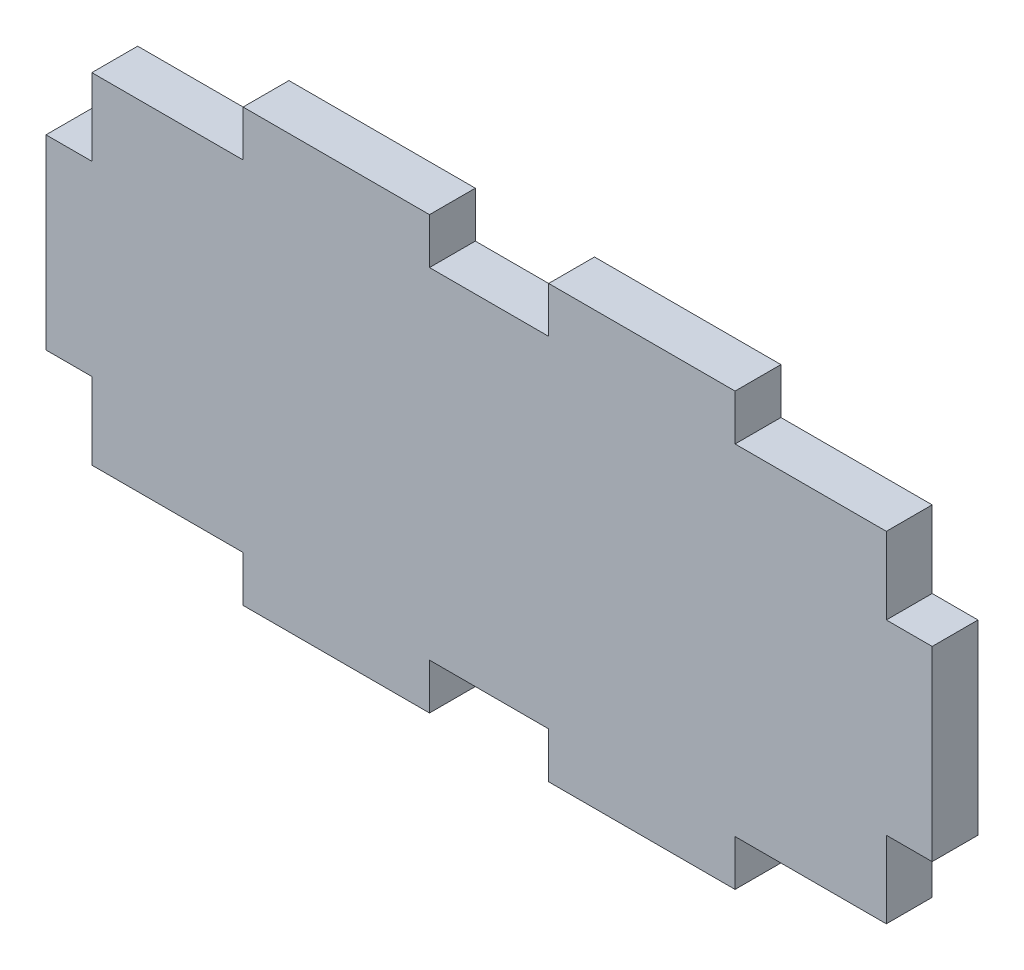
ISO-10303-21;
HEADER;
FILE_DESCRIPTION(('STEP AP214'),'2;1');
FILE_NAME('part.step','',(''),(''),'','','');
FILE_SCHEMA(('AUTOMOTIVE_DESIGN { 1 0 10303 214 1 1 1 1 }'));
ENDSEC;
DATA;
#1=APPLICATION_CONTEXT('core data for automotive mechanical design processes');
#2=APPLICATION_PROTOCOL_DEFINITION('international standard','automotive_design',2000,#1);
#3=PRODUCT_CONTEXT('',#1,'mechanical');
#4=PRODUCT('Part','Part','',(#3));
#5=PRODUCT_RELATED_PRODUCT_CATEGORY('part','',(#4));
#6=PRODUCT_DEFINITION_FORMATION('','',#4);
#7=PRODUCT_DEFINITION_CONTEXT('part definition',#1,'design');
#8=PRODUCT_DEFINITION('design','',#6,#7);
#9=PRODUCT_DEFINITION_SHAPE('','',#8);
#10=(LENGTH_UNIT() NAMED_UNIT(*) SI_UNIT(.MILLI.,.METRE.));
#11=(NAMED_UNIT(*) PLANE_ANGLE_UNIT() SI_UNIT($,.RADIAN.));
#12=(NAMED_UNIT(*) SI_UNIT($,.STERADIAN.) SOLID_ANGLE_UNIT());
#13=UNCERTAINTY_MEASURE_WITH_UNIT(LENGTH_MEASURE(1.E-05),#10,'distance_accuracy_value','');
#14=(GEOMETRIC_REPRESENTATION_CONTEXT(3) GLOBAL_UNCERTAINTY_ASSIGNED_CONTEXT((#13)) GLOBAL_UNIT_ASSIGNED_CONTEXT((#10,
#11,#12)) REPRESENTATION_CONTEXT('',''));
#15=CARTESIAN_POINT('',(0.,0.,0.));
#16=DIRECTION('',(0.,0.,1.));
#17=DIRECTION('',(1.,0.,0.));
#18=AXIS2_PLACEMENT_3D('',#15,#16,#17);
#19=CARTESIAN_POINT('',(12.9,25.25,3.));
#20=DIRECTION('',(1.,0.,0.));
#21=DIRECTION('',(0.,0.,-1.));
#22=AXIS2_PLACEMENT_3D('',#19,#20,#21);
#23=PLANE('',#22);
#24=DIRECTION('',(0.,-1.,0.));
#25=VECTOR('',#24,1.);
#26=CARTESIAN_POINT('',(12.9,25.25,0.));
#27=LINE('',#26,#25);
#28=CARTESIAN_POINT('',(12.9,28.25,0.));
#29=VERTEX_POINT('',#28);
#30=CARTESIAN_POINT('',(12.9,25.25,0.));
#31=VERTEX_POINT('',#30);
#32=EDGE_CURVE('E248',#29,#31,#27,.T.);
#33=ORIENTED_EDGE('',*,*,#32,.T.);
#34=DIRECTION('',(0.,0.,-1.));
#35=VECTOR('',#34,1.);
#36=CARTESIAN_POINT('',(12.9,25.25,3.));
#37=LINE('',#36,#35);
#38=CARTESIAN_POINT('',(12.9,25.25,3.));
#39=VERTEX_POINT('',#38);
#40=EDGE_CURVE('E11',#39,#31,#37,.T.);
#41=ORIENTED_EDGE('',*,*,#40,.F.);
#42=DIRECTION('',(0.,-1.,0.));
#43=VECTOR('',#42,1.);
#44=CARTESIAN_POINT('',(12.9,25.25,3.));
#45=LINE('',#44,#43);
#46=CARTESIAN_POINT('',(12.9,28.25,3.));
#47=VERTEX_POINT('',#46);
#48=EDGE_CURVE('E302',#47,#39,#45,.T.);
#49=ORIENTED_EDGE('',*,*,#48,.F.);
#50=DIRECTION('',(0.,0.,-1.));
#51=VECTOR('',#50,1.);
#52=CARTESIAN_POINT('',(12.9,28.25,3.));
#53=LINE('',#52,#51);
#54=EDGE_CURVE('E244',#47,#29,#53,.T.);
#55=ORIENTED_EDGE('',*,*,#54,.T.);
#56=EDGE_LOOP('',(#33,#41,#49,#55));
#57=FACE_BOUND('',#56,.T.);
#58=ADVANCED_FACE('F32',(#57),#23,.F.);
#59=CARTESIAN_POINT('',(3.,25.25,3.));
#60=DIRECTION('',(0.,-1.,0.));
#61=DIRECTION('',(0.,0.,-1.));
#62=AXIS2_PLACEMENT_3D('',#59,#60,#61);
#63=PLANE('',#62);
#64=DIRECTION('',(-1.,0.,0.));
#65=VECTOR('',#64,1.);
#66=CARTESIAN_POINT('',(3.,25.25,0.));
#67=LINE('',#66,#65);
#68=CARTESIAN_POINT('',(3.,25.25,0.));
#69=VERTEX_POINT('',#68);
#70=EDGE_CURVE('E251',#31,#69,#67,.T.);
#71=ORIENTED_EDGE('',*,*,#70,.T.);
#72=DIRECTION('',(0.,0.,-1.));
#73=VECTOR('',#72,1.);
#74=CARTESIAN_POINT('',(3.,25.25,3.));
#75=LINE('',#74,#73);
#76=CARTESIAN_POINT('',(3.,25.25,3.));
#77=VERTEX_POINT('',#76);
#78=EDGE_CURVE('E40',#77,#69,#75,.T.);
#79=ORIENTED_EDGE('',*,*,#78,.F.);
#80=DIRECTION('',(-1.,0.,0.));
#81=VECTOR('',#80,1.);
#82=CARTESIAN_POINT('',(3.,25.25,3.));
#83=LINE('',#82,#81);
#84=EDGE_CURVE('E151',#39,#77,#83,.T.);
#85=ORIENTED_EDGE('',*,*,#84,.F.);
#86=ORIENTED_EDGE('',*,*,#40,.T.);
#87=EDGE_LOOP('',(#71,#79,#85,#86));
#88=FACE_BOUND('',#87,.T.);
#89=ADVANCED_FACE('F460',(#88),#63,.F.);
#90=CARTESIAN_POINT('',(3.,20.225,3.));
#91=DIRECTION('',(1.,0.,0.));
#92=DIRECTION('',(0.,0.,-1.));
#93=AXIS2_PLACEMENT_3D('',#90,#91,#92);
#94=PLANE('',#93);
#95=DIRECTION('',(0.,-1.,0.));
#96=VECTOR('',#95,1.);
#97=CARTESIAN_POINT('',(3.,20.225,0.));
#98=LINE('',#97,#96);
#99=CARTESIAN_POINT('',(3.,20.225,0.));
#100=VERTEX_POINT('',#99);
#101=EDGE_CURVE('E253',#69,#100,#98,.T.);
#102=ORIENTED_EDGE('',*,*,#101,.T.);
#103=DIRECTION('',(0.,0.,-1.));
#104=VECTOR('',#103,1.);
#105=CARTESIAN_POINT('',(3.,20.225,3.));
#106=LINE('',#105,#104);
#107=CARTESIAN_POINT('',(3.,20.225,3.));
#108=VERTEX_POINT('',#107);
#109=EDGE_CURVE('E369',#108,#100,#106,.T.);
#110=ORIENTED_EDGE('',*,*,#109,.F.);
#111=DIRECTION('',(0.,-1.,0.));
#112=VECTOR('',#111,1.);
#113=CARTESIAN_POINT('',(3.,20.225,3.));
#114=LINE('',#113,#112);
#115=EDGE_CURVE('E377',#77,#108,#114,.T.);
#116=ORIENTED_EDGE('',*,*,#115,.F.);
#117=ORIENTED_EDGE('',*,*,#78,.T.);
#118=EDGE_LOOP('',(#102,#110,#116,#117));
#119=FACE_BOUND('',#118,.T.);
#120=ADVANCED_FACE('F375',(#119),#94,.F.);
#121=CARTESIAN_POINT('',(0.,20.225,3.));
#122=DIRECTION('',(0.,-1.,0.));
#123=DIRECTION('',(0.,0.,-1.));
#124=AXIS2_PLACEMENT_3D('',#121,#122,#123);
#125=PLANE('',#124);
#126=DIRECTION('',(-1.,0.,0.));
#127=VECTOR('',#126,1.);
#128=CARTESIAN_POINT('',(0.,20.225,0.));
#129=LINE('',#128,#127);
#130=CARTESIAN_POINT('',(0.,20.225,0.));
#131=VERTEX_POINT('',#130);
#132=EDGE_CURVE('E255',#100,#131,#129,.T.);
#133=ORIENTED_EDGE('',*,*,#132,.T.);
#134=DIRECTION('',(0.,0.,-1.));
#135=VECTOR('',#134,1.);
#136=CARTESIAN_POINT('',(0.,20.225,3.));
#137=LINE('',#136,#135);
#138=CARTESIAN_POINT('',(0.,20.225,3.));
#139=VERTEX_POINT('',#138);
#140=EDGE_CURVE('E366',#139,#131,#137,.T.);
#141=ORIENTED_EDGE('',*,*,#140,.F.);
#142=DIRECTION('',(-1.,0.,0.));
#143=VECTOR('',#142,1.);
#144=CARTESIAN_POINT('',(0.,20.225,3.));
#145=LINE('',#144,#143);
#146=EDGE_CURVE('E395',#108,#139,#145,.T.);
#147=ORIENTED_EDGE('',*,*,#146,.F.);
#148=ORIENTED_EDGE('',*,*,#109,.T.);
#149=EDGE_LOOP('',(#133,#141,#147,#148));
#150=FACE_BOUND('',#149,.T.);
#151=ADVANCED_FACE('F386',(#150),#125,.F.);
#152=CARTESIAN_POINT('',(0.,8.025,3.));
#153=DIRECTION('',(1.,0.,0.));
#154=DIRECTION('',(0.,1.,0.));
#155=AXIS2_PLACEMENT_3D('',#152,#153,#154);
#156=PLANE('',#155);
#157=DIRECTION('',(0.,-1.,0.));
#158=VECTOR('',#157,1.);
#159=CARTESIAN_POINT('',(0.,8.025,0.));
#160=LINE('',#159,#158);
#161=CARTESIAN_POINT('',(0.,8.025,0.));
#162=VERTEX_POINT('',#161);
#163=EDGE_CURVE('E257',#131,#162,#160,.T.);
#164=ORIENTED_EDGE('',*,*,#163,.T.);
#165=DIRECTION('',(0.,0.,-1.));
#166=VECTOR('',#165,1.);
#167=CARTESIAN_POINT('',(0.,8.025,3.));
#168=LINE('',#167,#166);
#169=CARTESIAN_POINT('',(0.,8.025,3.));
#170=VERTEX_POINT('',#169);
#171=EDGE_CURVE('E363',#170,#162,#168,.T.);
#172=ORIENTED_EDGE('',*,*,#171,.F.);
#173=DIRECTION('',(0.,-1.,0.));
#174=VECTOR('',#173,1.);
#175=CARTESIAN_POINT('',(0.,8.025,3.));
#176=LINE('',#175,#174);
#177=EDGE_CURVE('E392',#139,#170,#176,.T.);
#178=ORIENTED_EDGE('',*,*,#177,.F.);
#179=ORIENTED_EDGE('',*,*,#140,.T.);
#180=EDGE_LOOP('',(#164,#172,#178,#179));
#181=FACE_BOUND('',#180,.T.);
#182=ADVANCED_FACE('F390',(#181),#156,.F.);
#183=CARTESIAN_POINT('',(0.,8.025,3.));
#184=DIRECTION('',(0.,1.,0.));
#185=DIRECTION('',(0.,0.,1.));
#186=AXIS2_PLACEMENT_3D('',#183,#184,#185);
#187=PLANE('',#186);
#188=DIRECTION('',(1.,0.,0.));
#189=VECTOR('',#188,1.);
#190=CARTESIAN_POINT('',(0.,8.025,0.));
#191=LINE('',#190,#189);
#192=CARTESIAN_POINT('',(3.,8.025,0.));
#193=VERTEX_POINT('',#192);
#194=EDGE_CURVE('E259',#162,#193,#191,.T.);
#195=ORIENTED_EDGE('',*,*,#194,.T.);
#196=DIRECTION('',(0.,0.,-1.));
#197=VECTOR('',#196,1.);
#198=CARTESIAN_POINT('',(3.,8.025,3.));
#199=LINE('',#198,#197);
#200=CARTESIAN_POINT('',(3.,8.025,3.));
#201=VERTEX_POINT('',#200);
#202=EDGE_CURVE('E360',#201,#193,#199,.T.);
#203=ORIENTED_EDGE('',*,*,#202,.F.);
#204=DIRECTION('',(1.,0.,0.));
#205=VECTOR('',#204,1.);
#206=CARTESIAN_POINT('',(0.,8.025,3.));
#207=LINE('',#206,#205);
#208=EDGE_CURVE('E394',#170,#201,#207,.T.);
#209=ORIENTED_EDGE('',*,*,#208,.F.);
#210=ORIENTED_EDGE('',*,*,#171,.T.);
#211=EDGE_LOOP('',(#195,#203,#209,#210));
#212=FACE_BOUND('',#211,.T.);
#213=ADVANCED_FACE('F473',(#212),#187,.F.);
#214=CARTESIAN_POINT('',(3.,8.025,3.));
#215=DIRECTION('',(1.,0.,0.));
#216=DIRECTION('',(0.,0.,-1.));
#217=AXIS2_PLACEMENT_3D('',#214,#215,#216);
#218=PLANE('',#217);
#219=DIRECTION('',(0.,-1.,0.));
#220=VECTOR('',#219,1.);
#221=CARTESIAN_POINT('',(3.,8.025,0.));
#222=LINE('',#221,#220);
#223=CARTESIAN_POINT('',(3.,3.,0.));
#224=VERTEX_POINT('',#223);
#225=EDGE_CURVE('E261',#193,#224,#222,.T.);
#226=ORIENTED_EDGE('',*,*,#225,.T.);
#227=DIRECTION('',(0.,0.,-1.));
#228=VECTOR('',#227,1.);
#229=CARTESIAN_POINT('',(3.,3.,3.));
#230=LINE('',#229,#228);
#231=CARTESIAN_POINT('',(3.,3.,3.));
#232=VERTEX_POINT('',#231);
#233=EDGE_CURVE('E357',#232,#224,#230,.T.);
#234=ORIENTED_EDGE('',*,*,#233,.F.);
#235=DIRECTION('',(0.,-1.,0.));
#236=VECTOR('',#235,1.);
#237=CARTESIAN_POINT('',(3.,8.025,3.));
#238=LINE('',#237,#236);
#239=EDGE_CURVE('E397',#201,#232,#238,.T.);
#240=ORIENTED_EDGE('',*,*,#239,.F.);
#241=ORIENTED_EDGE('',*,*,#202,.T.);
#242=EDGE_LOOP('',(#226,#234,#240,#241));
#243=FACE_BOUND('',#242,.T.);
#244=ADVANCED_FACE('F476',(#243),#218,.F.);
#245=CARTESIAN_POINT('',(3.,3.,3.));
#246=DIRECTION('',(0.,1.,0.));
#247=DIRECTION('',(0.,0.,1.));
#248=AXIS2_PLACEMENT_3D('',#245,#246,#247);
#249=PLANE('',#248);
#250=DIRECTION('',(1.,0.,0.));
#251=VECTOR('',#250,1.);
#252=CARTESIAN_POINT('',(3.,3.,0.));
#253=LINE('',#252,#251);
#254=CARTESIAN_POINT('',(12.9,3.,0.));
#255=VERTEX_POINT('',#254);
#256=EDGE_CURVE('E263',#224,#255,#253,.T.);
#257=ORIENTED_EDGE('',*,*,#256,.T.);
#258=DIRECTION('',(0.,0.,-1.));
#259=VECTOR('',#258,1.);
#260=CARTESIAN_POINT('',(12.9,3.,3.));
#261=LINE('',#260,#259);
#262=CARTESIAN_POINT('',(12.9,3.,3.));
#263=VERTEX_POINT('',#262);
#264=EDGE_CURVE('E354',#263,#255,#261,.T.);
#265=ORIENTED_EDGE('',*,*,#264,.F.);
#266=DIRECTION('',(1.,0.,0.));
#267=VECTOR('',#266,1.);
#268=CARTESIAN_POINT('',(3.,3.,3.));
#269=LINE('',#268,#267);
#270=EDGE_CURVE('E403',#232,#263,#269,.T.);
#271=ORIENTED_EDGE('',*,*,#270,.F.);
#272=ORIENTED_EDGE('',*,*,#233,.T.);
#273=EDGE_LOOP('',(#257,#265,#271,#272));
#274=FACE_BOUND('',#273,.T.);
#275=ADVANCED_FACE('F480',(#274),#249,.F.);
#276=CARTESIAN_POINT('',(12.9,0.,3.));
#277=DIRECTION('',(1.,0.,0.));
#278=DIRECTION('',(0.,0.,-1.));
#279=AXIS2_PLACEMENT_3D('',#276,#277,#278);
#280=PLANE('',#279);
#281=DIRECTION('',(0.,-1.,0.));
#282=VECTOR('',#281,1.);
#283=CARTESIAN_POINT('',(12.9,0.,0.));
#284=LINE('',#283,#282);
#285=CARTESIAN_POINT('',(12.9,0.,0.));
#286=VERTEX_POINT('',#285);
#287=EDGE_CURVE('E265',#255,#286,#284,.T.);
#288=ORIENTED_EDGE('',*,*,#287,.T.);
#289=DIRECTION('',(0.,0.,-1.));
#290=VECTOR('',#289,1.);
#291=CARTESIAN_POINT('',(12.9,0.,3.));
#292=LINE('',#291,#290);
#293=CARTESIAN_POINT('',(12.9,0.,3.));
#294=VERTEX_POINT('',#293);
#295=EDGE_CURVE('E351',#294,#286,#292,.T.);
#296=ORIENTED_EDGE('',*,*,#295,.F.);
#297=DIRECTION('',(0.,-1.,0.));
#298=VECTOR('',#297,1.);
#299=CARTESIAN_POINT('',(12.9,0.,3.));
#300=LINE('',#299,#298);
#301=EDGE_CURVE('E405',#263,#294,#300,.T.);
#302=ORIENTED_EDGE('',*,*,#301,.F.);
#303=ORIENTED_EDGE('',*,*,#264,.T.);
#304=EDGE_LOOP('',(#288,#296,#302,#303));
#305=FACE_BOUND('',#304,.T.);
#306=ADVANCED_FACE('F484',(#305),#280,.F.);
#307=CARTESIAN_POINT('',(12.9,0.,3.));
#308=DIRECTION('',(0.,1.,0.));
#309=DIRECTION('',(0.,0.,1.));
#310=AXIS2_PLACEMENT_3D('',#307,#308,#309);
#311=PLANE('',#310);
#312=DIRECTION('',(1.,0.,0.));
#313=VECTOR('',#312,1.);
#314=CARTESIAN_POINT('',(12.9,0.,0.));
#315=LINE('',#314,#313);
#316=CARTESIAN_POINT('',(25.1,0.,0.));
#317=VERTEX_POINT('',#316);
#318=EDGE_CURVE('E267',#286,#317,#315,.T.);
#319=ORIENTED_EDGE('',*,*,#318,.T.);
#320=DIRECTION('',(0.,0.,-1.));
#321=VECTOR('',#320,1.);
#322=CARTESIAN_POINT('',(25.1,0.,3.));
#323=LINE('',#322,#321);
#324=CARTESIAN_POINT('',(25.1,0.,3.));
#325=VERTEX_POINT('',#324);
#326=EDGE_CURVE('E348',#325,#317,#323,.T.);
#327=ORIENTED_EDGE('',*,*,#326,.F.);
#328=DIRECTION('',(1.,0.,0.));
#329=VECTOR('',#328,1.);
#330=CARTESIAN_POINT('',(12.9,0.,3.));
#331=LINE('',#330,#329);
#332=EDGE_CURVE('E407',#294,#325,#331,.T.);
#333=ORIENTED_EDGE('',*,*,#332,.F.);
#334=ORIENTED_EDGE('',*,*,#295,.T.);
#335=EDGE_LOOP('',(#319,#327,#333,#334));
#336=FACE_BOUND('',#335,.T.);
#337=ADVANCED_FACE('F488',(#336),#311,.F.);
#338=CARTESIAN_POINT('',(25.1,0.,3.));
#339=DIRECTION('',(-1.,0.,0.));
#340=DIRECTION('',(0.,0.,1.));
#341=AXIS2_PLACEMENT_3D('',#338,#339,#340);
#342=PLANE('',#341);
#343=DIRECTION('',(0.,1.,0.));
#344=VECTOR('',#343,1.);
#345=CARTESIAN_POINT('',(25.1,0.,0.));
#346=LINE('',#345,#344);
#347=CARTESIAN_POINT('',(25.1,3.,0.));
#348=VERTEX_POINT('',#347);
#349=EDGE_CURVE('E269',#317,#348,#346,.T.);
#350=ORIENTED_EDGE('',*,*,#349,.T.);
#351=DIRECTION('',(0.,0.,-1.));
#352=VECTOR('',#351,1.);
#353=CARTESIAN_POINT('',(25.1,3.,3.));
#354=LINE('',#353,#352);
#355=CARTESIAN_POINT('',(25.1,3.,3.));
#356=VERTEX_POINT('',#355);
#357=EDGE_CURVE('E345',#356,#348,#354,.T.);
#358=ORIENTED_EDGE('',*,*,#357,.F.);
#359=DIRECTION('',(0.,1.,0.));
#360=VECTOR('',#359,1.);
#361=CARTESIAN_POINT('',(25.1,0.,3.));
#362=LINE('',#361,#360);
#363=EDGE_CURVE('E409',#325,#356,#362,.T.);
#364=ORIENTED_EDGE('',*,*,#363,.F.);
#365=ORIENTED_EDGE('',*,*,#326,.T.);
#366=EDGE_LOOP('',(#350,#358,#364,#365));
#367=FACE_BOUND('',#366,.T.);
#368=ADVANCED_FACE('F492',(#367),#342,.F.);
#369=CARTESIAN_POINT('',(25.1,3.,3.));
#370=DIRECTION('',(0.,1.,0.));
#371=DIRECTION('',(0.,0.,1.));
#372=AXIS2_PLACEMENT_3D('',#369,#370,#371);
#373=PLANE('',#372);
#374=DIRECTION('',(1.,0.,0.));
#375=VECTOR('',#374,1.);
#376=CARTESIAN_POINT('',(25.1,3.,0.));
#377=LINE('',#376,#375);
#378=CARTESIAN_POINT('',(32.9,3.,0.));
#379=VERTEX_POINT('',#378);
#380=EDGE_CURVE('E271',#348,#379,#377,.T.);
#381=ORIENTED_EDGE('',*,*,#380,.T.);
#382=DIRECTION('',(0.,0.,-1.));
#383=VECTOR('',#382,1.);
#384=CARTESIAN_POINT('',(32.9,3.,3.));
#385=LINE('',#384,#383);
#386=CARTESIAN_POINT('',(32.9,3.,3.));
#387=VERTEX_POINT('',#386);
#388=EDGE_CURVE('E342',#387,#379,#385,.T.);
#389=ORIENTED_EDGE('',*,*,#388,.F.);
#390=DIRECTION('',(1.,0.,0.));
#391=VECTOR('',#390,1.);
#392=CARTESIAN_POINT('',(25.1,3.,3.));
#393=LINE('',#392,#391);
#394=EDGE_CURVE('E411',#356,#387,#393,.T.);
#395=ORIENTED_EDGE('',*,*,#394,.F.);
#396=ORIENTED_EDGE('',*,*,#357,.T.);
#397=EDGE_LOOP('',(#381,#389,#395,#396));
#398=FACE_BOUND('',#397,.T.);
#399=ADVANCED_FACE('F496',(#398),#373,.F.);
#400=CARTESIAN_POINT('',(32.9,3.,3.));
#401=DIRECTION('',(1.,0.,0.));
#402=DIRECTION('',(0.,0.,-1.));
#403=AXIS2_PLACEMENT_3D('',#400,#401,#402);
#404=PLANE('',#403);
#405=DIRECTION('',(0.,-1.,0.));
#406=VECTOR('',#405,1.);
#407=CARTESIAN_POINT('',(32.9,3.,0.));
#408=LINE('',#407,#406);
#409=CARTESIAN_POINT('',(32.9,0.,0.));
#410=VERTEX_POINT('',#409);
#411=EDGE_CURVE('E273',#379,#410,#408,.T.);
#412=ORIENTED_EDGE('',*,*,#411,.T.);
#413=DIRECTION('',(0.,0.,-1.));
#414=VECTOR('',#413,1.);
#415=CARTESIAN_POINT('',(32.9,0.,3.));
#416=LINE('',#415,#414);
#417=CARTESIAN_POINT('',(32.9,0.,3.));
#418=VERTEX_POINT('',#417);
#419=EDGE_CURVE('E339',#418,#410,#416,.T.);
#420=ORIENTED_EDGE('',*,*,#419,.F.);
#421=DIRECTION('',(0.,-1.,0.));
#422=VECTOR('',#421,1.);
#423=CARTESIAN_POINT('',(32.9,3.,3.));
#424=LINE('',#423,#422);
#425=EDGE_CURVE('E413',#387,#418,#424,.T.);
#426=ORIENTED_EDGE('',*,*,#425,.F.);
#427=ORIENTED_EDGE('',*,*,#388,.T.);
#428=EDGE_LOOP('',(#412,#420,#426,#427));
#429=FACE_BOUND('',#428,.T.);
#430=ADVANCED_FACE('F500',(#429),#404,.F.);
#431=CARTESIAN_POINT('',(32.9,0.,3.));
#432=DIRECTION('',(0.,1.,0.));
#433=DIRECTION('',(0.,0.,1.));
#434=AXIS2_PLACEMENT_3D('',#431,#432,#433);
#435=PLANE('',#434);
#436=DIRECTION('',(1.,0.,0.));
#437=VECTOR('',#436,1.);
#438=CARTESIAN_POINT('',(32.9,0.,0.));
#439=LINE('',#438,#437);
#440=CARTESIAN_POINT('',(45.1,0.,0.));
#441=VERTEX_POINT('',#440);
#442=EDGE_CURVE('E275',#410,#441,#439,.T.);
#443=ORIENTED_EDGE('',*,*,#442,.T.);
#444=DIRECTION('',(0.,0.,-1.));
#445=VECTOR('',#444,1.);
#446=CARTESIAN_POINT('',(45.1,0.,3.));
#447=LINE('',#446,#445);
#448=CARTESIAN_POINT('',(45.1,0.,3.));
#449=VERTEX_POINT('',#448);
#450=EDGE_CURVE('E336',#449,#441,#447,.T.);
#451=ORIENTED_EDGE('',*,*,#450,.F.);
#452=DIRECTION('',(1.,0.,0.));
#453=VECTOR('',#452,1.);
#454=CARTESIAN_POINT('',(32.9,0.,3.));
#455=LINE('',#454,#453);
#456=EDGE_CURVE('E415',#418,#449,#455,.T.);
#457=ORIENTED_EDGE('',*,*,#456,.F.);
#458=ORIENTED_EDGE('',*,*,#419,.T.);
#459=EDGE_LOOP('',(#443,#451,#457,#458));
#460=FACE_BOUND('',#459,.T.);
#461=ADVANCED_FACE('F504',(#460),#435,.F.);
#462=CARTESIAN_POINT('',(45.1,3.,3.));
#463=DIRECTION('',(-1.,0.,0.));
#464=DIRECTION('',(0.,0.,1.));
#465=AXIS2_PLACEMENT_3D('',#462,#463,#464);
#466=PLANE('',#465);
#467=DIRECTION('',(0.,1.,0.));
#468=VECTOR('',#467,1.);
#469=CARTESIAN_POINT('',(45.1,3.,0.));
#470=LINE('',#469,#468);
#471=CARTESIAN_POINT('',(45.1,3.,0.));
#472=VERTEX_POINT('',#471);
#473=EDGE_CURVE('E277',#441,#472,#470,.T.);
#474=ORIENTED_EDGE('',*,*,#473,.T.);
#475=DIRECTION('',(0.,0.,-1.));
#476=VECTOR('',#475,1.);
#477=CARTESIAN_POINT('',(45.1,3.,3.));
#478=LINE('',#477,#476);
#479=CARTESIAN_POINT('',(45.1,3.,3.));
#480=VERTEX_POINT('',#479);
#481=EDGE_CURVE('E333',#480,#472,#478,.T.);
#482=ORIENTED_EDGE('',*,*,#481,.F.);
#483=DIRECTION('',(0.,1.,0.));
#484=VECTOR('',#483,1.);
#485=CARTESIAN_POINT('',(45.1,3.,3.));
#486=LINE('',#485,#484);
#487=EDGE_CURVE('E417',#449,#480,#486,.T.);
#488=ORIENTED_EDGE('',*,*,#487,.F.);
#489=ORIENTED_EDGE('',*,*,#450,.T.);
#490=EDGE_LOOP('',(#474,#482,#488,#489));
#491=FACE_BOUND('',#490,.T.);
#492=ADVANCED_FACE('F508',(#491),#466,.F.);
#493=CARTESIAN_POINT('',(45.1,3.,3.));
#494=DIRECTION('',(0.,1.,0.));
#495=DIRECTION('',(0.,0.,1.));
#496=AXIS2_PLACEMENT_3D('',#493,#494,#495);
#497=PLANE('',#496);
#498=DIRECTION('',(1.,0.,0.));
#499=VECTOR('',#498,1.);
#500=CARTESIAN_POINT('',(45.1,3.,0.));
#501=LINE('',#500,#499);
#502=CARTESIAN_POINT('',(55.,3.,0.));
#503=VERTEX_POINT('',#502);
#504=EDGE_CURVE('E279',#472,#503,#501,.T.);
#505=ORIENTED_EDGE('',*,*,#504,.T.);
#506=DIRECTION('',(0.,0.,-1.));
#507=VECTOR('',#506,1.);
#508=CARTESIAN_POINT('',(55.,3.,3.));
#509=LINE('',#508,#507);
#510=CARTESIAN_POINT('',(55.,3.,3.));
#511=VERTEX_POINT('',#510);
#512=EDGE_CURVE('E330',#511,#503,#509,.T.);
#513=ORIENTED_EDGE('',*,*,#512,.F.);
#514=DIRECTION('',(1.,0.,0.));
#515=VECTOR('',#514,1.);
#516=CARTESIAN_POINT('',(45.1,3.,3.));
#517=LINE('',#516,#515);
#518=EDGE_CURVE('E419',#480,#511,#517,.T.);
#519=ORIENTED_EDGE('',*,*,#518,.F.);
#520=ORIENTED_EDGE('',*,*,#481,.T.);
#521=EDGE_LOOP('',(#505,#513,#519,#520));
#522=FACE_BOUND('',#521,.T.);
#523=ADVANCED_FACE('F512',(#522),#497,.F.);
#524=CARTESIAN_POINT('',(55.,8.025,3.));
#525=DIRECTION('',(-1.,0.,0.));
#526=DIRECTION('',(0.,0.,1.));
#527=AXIS2_PLACEMENT_3D('',#524,#525,#526);
#528=PLANE('',#527);
#529=DIRECTION('',(0.,1.,0.));
#530=VECTOR('',#529,1.);
#531=CARTESIAN_POINT('',(55.,8.025,0.));
#532=LINE('',#531,#530);
#533=CARTESIAN_POINT('',(55.,8.025,0.));
#534=VERTEX_POINT('',#533);
#535=EDGE_CURVE('E281',#503,#534,#532,.T.);
#536=ORIENTED_EDGE('',*,*,#535,.T.);
#537=DIRECTION('',(0.,0.,-1.));
#538=VECTOR('',#537,1.);
#539=CARTESIAN_POINT('',(55.,8.025,3.));
#540=LINE('',#539,#538);
#541=CARTESIAN_POINT('',(55.,8.025,3.));
#542=VERTEX_POINT('',#541);
#543=EDGE_CURVE('E327',#542,#534,#540,.T.);
#544=ORIENTED_EDGE('',*,*,#543,.F.);
#545=DIRECTION('',(0.,1.,0.));
#546=VECTOR('',#545,1.);
#547=CARTESIAN_POINT('',(55.,8.025,3.));
#548=LINE('',#547,#546);
#549=EDGE_CURVE('E421',#511,#542,#548,.T.);
#550=ORIENTED_EDGE('',*,*,#549,.F.);
#551=ORIENTED_EDGE('',*,*,#512,.T.);
#552=EDGE_LOOP('',(#536,#544,#550,#551));
#553=FACE_BOUND('',#552,.T.);
#554=ADVANCED_FACE('F516',(#553),#528,.F.);
#555=CARTESIAN_POINT('',(58.,8.025,3.));
#556=DIRECTION('',(0.,1.,0.));
#557=DIRECTION('',(0.,0.,1.));
#558=AXIS2_PLACEMENT_3D('',#555,#556,#557);
#559=PLANE('',#558);
#560=DIRECTION('',(1.,0.,0.));
#561=VECTOR('',#560,1.);
#562=CARTESIAN_POINT('',(58.,8.025,0.));
#563=LINE('',#562,#561);
#564=CARTESIAN_POINT('',(58.,8.025,0.));
#565=VERTEX_POINT('',#564);
#566=EDGE_CURVE('E283',#534,#565,#563,.T.);
#567=ORIENTED_EDGE('',*,*,#566,.T.);
#568=DIRECTION('',(0.,0.,-1.));
#569=VECTOR('',#568,1.);
#570=CARTESIAN_POINT('',(58.,8.025,3.));
#571=LINE('',#570,#569);
#572=CARTESIAN_POINT('',(58.,8.025,3.));
#573=VERTEX_POINT('',#572);
#574=EDGE_CURVE('E324',#573,#565,#571,.T.);
#575=ORIENTED_EDGE('',*,*,#574,.F.);
#576=DIRECTION('',(1.,0.,0.));
#577=VECTOR('',#576,1.);
#578=CARTESIAN_POINT('',(58.,8.025,3.));
#579=LINE('',#578,#577);
#580=EDGE_CURVE('E423',#542,#573,#579,.T.);
#581=ORIENTED_EDGE('',*,*,#580,.F.);
#582=ORIENTED_EDGE('',*,*,#543,.T.);
#583=EDGE_LOOP('',(#567,#575,#581,#582));
#584=FACE_BOUND('',#583,.T.);
#585=ADVANCED_FACE('F520',(#584),#559,.F.);
#586=CARTESIAN_POINT('',(58.,8.025,3.));
#587=DIRECTION('',(-1.,0.,0.));
#588=DIRECTION('',(0.,0.,1.));
#589=AXIS2_PLACEMENT_3D('',#586,#587,#588);
#590=PLANE('',#589);
#591=DIRECTION('',(0.,1.,0.));
#592=VECTOR('',#591,1.);
#593=CARTESIAN_POINT('',(58.,8.025,0.));
#594=LINE('',#593,#592);
#595=CARTESIAN_POINT('',(58.,20.225,0.));
#596=VERTEX_POINT('',#595);
#597=EDGE_CURVE('E285',#565,#596,#594,.T.);
#598=ORIENTED_EDGE('',*,*,#597,.T.);
#599=DIRECTION('',(0.,0.,-1.));
#600=VECTOR('',#599,1.);
#601=CARTESIAN_POINT('',(58.,20.225,3.));
#602=LINE('',#601,#600);
#603=CARTESIAN_POINT('',(58.,20.225,3.));
#604=VERTEX_POINT('',#603);
#605=EDGE_CURVE('E321',#604,#596,#602,.T.);
#606=ORIENTED_EDGE('',*,*,#605,.F.);
#607=DIRECTION('',(0.,1.,0.));
#608=VECTOR('',#607,1.);
#609=CARTESIAN_POINT('',(58.,8.025,3.));
#610=LINE('',#609,#608);
#611=EDGE_CURVE('E425',#573,#604,#610,.T.);
#612=ORIENTED_EDGE('',*,*,#611,.F.);
#613=ORIENTED_EDGE('',*,*,#574,.T.);
#614=EDGE_LOOP('',(#598,#606,#612,#613));
#615=FACE_BOUND('',#614,.T.);
#616=ADVANCED_FACE('F524',(#615),#590,.F.);
#617=CARTESIAN_POINT('',(58.,20.225,3.));
#618=DIRECTION('',(0.,-1.,0.));
#619=DIRECTION('',(0.,0.,-1.));
#620=AXIS2_PLACEMENT_3D('',#617,#618,#619);
#621=PLANE('',#620);
#622=DIRECTION('',(-1.,0.,0.));
#623=VECTOR('',#622,1.);
#624=CARTESIAN_POINT('',(58.,20.225,0.));
#625=LINE('',#624,#623);
#626=CARTESIAN_POINT('',(55.,20.225,0.));
#627=VERTEX_POINT('',#626);
#628=EDGE_CURVE('E287',#596,#627,#625,.T.);
#629=ORIENTED_EDGE('',*,*,#628,.T.);
#630=DIRECTION('',(0.,0.,-1.));
#631=VECTOR('',#630,1.);
#632=CARTESIAN_POINT('',(55.,20.225,3.));
#633=LINE('',#632,#631);
#634=CARTESIAN_POINT('',(55.,20.225,3.));
#635=VERTEX_POINT('',#634);
#636=EDGE_CURVE('E318',#635,#627,#633,.T.);
#637=ORIENTED_EDGE('',*,*,#636,.F.);
#638=DIRECTION('',(-1.,0.,0.));
#639=VECTOR('',#638,1.);
#640=CARTESIAN_POINT('',(58.,20.225,3.));
#641=LINE('',#640,#639);
#642=EDGE_CURVE('E427',#604,#635,#641,.T.);
#643=ORIENTED_EDGE('',*,*,#642,.F.);
#644=ORIENTED_EDGE('',*,*,#605,.T.);
#645=EDGE_LOOP('',(#629,#637,#643,#644));
#646=FACE_BOUND('',#645,.T.);
#647=ADVANCED_FACE('F528',(#646),#621,.F.);
#648=CARTESIAN_POINT('',(55.,20.225,3.));
#649=DIRECTION('',(-1.,0.,0.));
#650=DIRECTION('',(0.,0.,1.));
#651=AXIS2_PLACEMENT_3D('',#648,#649,#650);
#652=PLANE('',#651);
#653=DIRECTION('',(0.,1.,0.));
#654=VECTOR('',#653,1.);
#655=CARTESIAN_POINT('',(55.,20.225,0.));
#656=LINE('',#655,#654);
#657=CARTESIAN_POINT('',(55.,25.25,0.));
#658=VERTEX_POINT('',#657);
#659=EDGE_CURVE('E289',#627,#658,#656,.T.);
#660=ORIENTED_EDGE('',*,*,#659,.T.);
#661=DIRECTION('',(0.,0.,-1.));
#662=VECTOR('',#661,1.);
#663=CARTESIAN_POINT('',(55.,25.25,3.));
#664=LINE('',#663,#662);
#665=CARTESIAN_POINT('',(55.,25.25,3.));
#666=VERTEX_POINT('',#665);
#667=EDGE_CURVE('E315',#666,#658,#664,.T.);
#668=ORIENTED_EDGE('',*,*,#667,.F.);
#669=DIRECTION('',(0.,1.,0.));
#670=VECTOR('',#669,1.);
#671=CARTESIAN_POINT('',(55.,20.225,3.));
#672=LINE('',#671,#670);
#673=EDGE_CURVE('E429',#635,#666,#672,.T.);
#674=ORIENTED_EDGE('',*,*,#673,.F.);
#675=ORIENTED_EDGE('',*,*,#636,.T.);
#676=EDGE_LOOP('',(#660,#668,#674,#675));
#677=FACE_BOUND('',#676,.T.);
#678=ADVANCED_FACE('F532',(#677),#652,.F.);
#679=CARTESIAN_POINT('',(45.1,25.25,3.));
#680=DIRECTION('',(0.,-1.,0.));
#681=DIRECTION('',(0.,0.,-1.));
#682=AXIS2_PLACEMENT_3D('',#679,#680,#681);
#683=PLANE('',#682);
#684=DIRECTION('',(-1.,0.,0.));
#685=VECTOR('',#684,1.);
#686=CARTESIAN_POINT('',(45.1,25.25,0.));
#687=LINE('',#686,#685);
#688=CARTESIAN_POINT('',(45.1,25.25,0.));
#689=VERTEX_POINT('',#688);
#690=EDGE_CURVE('E291',#658,#689,#687,.T.);
#691=ORIENTED_EDGE('',*,*,#690,.T.);
#692=DIRECTION('',(0.,0.,-1.));
#693=VECTOR('',#692,1.);
#694=CARTESIAN_POINT('',(45.1,25.25,3.));
#695=LINE('',#694,#693);
#696=CARTESIAN_POINT('',(45.1,25.25,3.));
#697=VERTEX_POINT('',#696);
#698=EDGE_CURVE('E312',#697,#689,#695,.T.);
#699=ORIENTED_EDGE('',*,*,#698,.F.);
#700=DIRECTION('',(-1.,0.,0.));
#701=VECTOR('',#700,1.);
#702=CARTESIAN_POINT('',(45.1,25.25,3.));
#703=LINE('',#702,#701);
#704=EDGE_CURVE('E431',#666,#697,#703,.T.);
#705=ORIENTED_EDGE('',*,*,#704,.F.);
#706=ORIENTED_EDGE('',*,*,#667,.T.);
#707=EDGE_LOOP('',(#691,#699,#705,#706));
#708=FACE_BOUND('',#707,.T.);
#709=ADVANCED_FACE('F536',(#708),#683,.F.);
#710=CARTESIAN_POINT('',(45.1,28.25,3.));
#711=DIRECTION('',(-1.,0.,0.));
#712=DIRECTION('',(0.,0.,1.));
#713=AXIS2_PLACEMENT_3D('',#710,#711,#712);
#714=PLANE('',#713);
#715=DIRECTION('',(0.,1.,0.));
#716=VECTOR('',#715,1.);
#717=CARTESIAN_POINT('',(45.1,28.25,0.));
#718=LINE('',#717,#716);
#719=CARTESIAN_POINT('',(45.1,28.25,0.));
#720=VERTEX_POINT('',#719);
#721=EDGE_CURVE('E293',#689,#720,#718,.T.);
#722=ORIENTED_EDGE('',*,*,#721,.T.);
#723=DIRECTION('',(0.,0.,-1.));
#724=VECTOR('',#723,1.);
#725=CARTESIAN_POINT('',(45.1,28.25,3.));
#726=LINE('',#725,#724);
#727=CARTESIAN_POINT('',(45.1,28.25,3.));
#728=VERTEX_POINT('',#727);
#729=EDGE_CURVE('E309',#728,#720,#726,.T.);
#730=ORIENTED_EDGE('',*,*,#729,.F.);
#731=DIRECTION('',(0.,1.,0.));
#732=VECTOR('',#731,1.);
#733=CARTESIAN_POINT('',(45.1,28.25,3.));
#734=LINE('',#733,#732);
#735=EDGE_CURVE('E433',#697,#728,#734,.T.);
#736=ORIENTED_EDGE('',*,*,#735,.F.);
#737=ORIENTED_EDGE('',*,*,#698,.T.);
#738=EDGE_LOOP('',(#722,#730,#736,#737));
#739=FACE_BOUND('',#738,.T.);
#740=ADVANCED_FACE('F540',(#739),#714,.F.);
#741=CARTESIAN_POINT('',(32.9,28.25,3.));
#742=DIRECTION('',(0.,-1.,0.));
#743=DIRECTION('',(0.,0.,-1.));
#744=AXIS2_PLACEMENT_3D('',#741,#742,#743);
#745=PLANE('',#744);
#746=DIRECTION('',(-1.,0.,0.));
#747=VECTOR('',#746,1.);
#748=CARTESIAN_POINT('',(32.9,28.25,0.));
#749=LINE('',#748,#747);
#750=CARTESIAN_POINT('',(32.9,28.25,0.));
#751=VERTEX_POINT('',#750);
#752=EDGE_CURVE('E295',#720,#751,#749,.T.);
#753=ORIENTED_EDGE('',*,*,#752,.T.);
#754=DIRECTION('',(0.,0.,-1.));
#755=VECTOR('',#754,1.);
#756=CARTESIAN_POINT('',(32.9,28.25,3.));
#757=LINE('',#756,#755);
#758=CARTESIAN_POINT('',(32.9,28.25,3.));
#759=VERTEX_POINT('',#758);
#760=EDGE_CURVE('E306',#759,#751,#757,.T.);
#761=ORIENTED_EDGE('',*,*,#760,.F.);
#762=DIRECTION('',(-1.,0.,0.));
#763=VECTOR('',#762,1.);
#764=CARTESIAN_POINT('',(32.9,28.25,3.));
#765=LINE('',#764,#763);
#766=EDGE_CURVE('E435',#728,#759,#765,.T.);
#767=ORIENTED_EDGE('',*,*,#766,.F.);
#768=ORIENTED_EDGE('',*,*,#729,.T.);
#769=EDGE_LOOP('',(#753,#761,#767,#768));
#770=FACE_BOUND('',#769,.T.);
#771=ADVANCED_FACE('F441',(#770),#745,.F.);
#772=CARTESIAN_POINT('',(32.9,28.25,3.));
#773=DIRECTION('',(1.,0.,0.));
#774=DIRECTION('',(0.,0.,-1.));
#775=AXIS2_PLACEMENT_3D('',#772,#773,#774);
#776=PLANE('',#775);
#777=DIRECTION('',(0.,-1.,0.));
#778=VECTOR('',#777,1.);
#779=CARTESIAN_POINT('',(32.9,28.25,0.));
#780=LINE('',#779,#778);
#781=CARTESIAN_POINT('',(32.9,25.25,0.));
#782=VERTEX_POINT('',#781);
#783=EDGE_CURVE('E297',#751,#782,#780,.T.);
#784=ORIENTED_EDGE('',*,*,#783,.T.);
#785=DIRECTION('',(0.,0.,-1.));
#786=VECTOR('',#785,1.);
#787=CARTESIAN_POINT('',(32.9,25.25,3.));
#788=LINE('',#787,#786);
#789=CARTESIAN_POINT('',(32.9,25.25,3.));
#790=VERTEX_POINT('',#789);
#791=EDGE_CURVE('E239',#790,#782,#788,.T.);
#792=ORIENTED_EDGE('',*,*,#791,.F.);
#793=DIRECTION('',(0.,-1.,0.));
#794=VECTOR('',#793,1.);
#795=CARTESIAN_POINT('',(32.9,28.25,3.));
#796=LINE('',#795,#794);
#797=EDGE_CURVE('E230',#759,#790,#796,.T.);
#798=ORIENTED_EDGE('',*,*,#797,.F.);
#799=ORIENTED_EDGE('',*,*,#760,.T.);
#800=EDGE_LOOP('',(#784,#792,#798,#799));
#801=FACE_BOUND('',#800,.T.);
#802=ADVANCED_FACE('F445',(#801),#776,.F.);
#803=CARTESIAN_POINT('',(25.1,25.25,3.));
#804=DIRECTION('',(0.,-1.,0.));
#805=DIRECTION('',(0.,0.,-1.));
#806=AXIS2_PLACEMENT_3D('',#803,#804,#805);
#807=PLANE('',#806);
#808=DIRECTION('',(-1.,0.,0.));
#809=VECTOR('',#808,1.);
#810=CARTESIAN_POINT('',(25.1,25.25,0.));
#811=LINE('',#810,#809);
#812=CARTESIAN_POINT('',(25.1,25.25,0.));
#813=VERTEX_POINT('',#812);
#814=EDGE_CURVE('E238',#782,#813,#811,.T.);
#815=ORIENTED_EDGE('',*,*,#814,.T.);
#816=DIRECTION('',(0.,0.,-1.));
#817=VECTOR('',#816,1.);
#818=CARTESIAN_POINT('',(25.1,25.25,3.));
#819=LINE('',#818,#817);
#820=CARTESIAN_POINT('',(25.1,25.25,3.));
#821=VERTEX_POINT('',#820);
#822=EDGE_CURVE('E235',#821,#813,#819,.T.);
#823=ORIENTED_EDGE('',*,*,#822,.F.);
#824=DIRECTION('',(-1.,0.,0.));
#825=VECTOR('',#824,1.);
#826=CARTESIAN_POINT('',(25.1,25.25,3.));
#827=LINE('',#826,#825);
#828=EDGE_CURVE('E224',#790,#821,#827,.T.);
#829=ORIENTED_EDGE('',*,*,#828,.F.);
#830=ORIENTED_EDGE('',*,*,#791,.T.);
#831=EDGE_LOOP('',(#815,#823,#829,#830));
#832=FACE_BOUND('',#831,.T.);
#833=ADVANCED_FACE('F236',(#832),#807,.F.);
#834=CARTESIAN_POINT('',(25.1,25.25,3.));
#835=DIRECTION('',(-1.,0.,0.));
#836=DIRECTION('',(0.,0.,1.));
#837=AXIS2_PLACEMENT_3D('',#834,#835,#836);
#838=PLANE('',#837);
#839=DIRECTION('',(0.,1.,0.));
#840=VECTOR('',#839,1.);
#841=CARTESIAN_POINT('',(25.1,25.25,0.));
#842=LINE('',#841,#840);
#843=CARTESIAN_POINT('',(25.1,28.25,0.));
#844=VERTEX_POINT('',#843);
#845=EDGE_CURVE('E137',#813,#844,#842,.T.);
#846=ORIENTED_EDGE('',*,*,#845,.T.);
#847=DIRECTION('',(0.,0.,-1.));
#848=VECTOR('',#847,1.);
#849=CARTESIAN_POINT('',(25.1,28.25,3.));
#850=LINE('',#849,#848);
#851=CARTESIAN_POINT('',(25.1,28.25,3.));
#852=VERTEX_POINT('',#851);
#853=EDGE_CURVE('E240',#852,#844,#850,.T.);
#854=ORIENTED_EDGE('',*,*,#853,.F.);
#855=DIRECTION('',(0.,1.,0.));
#856=VECTOR('',#855,1.);
#857=CARTESIAN_POINT('',(25.1,25.25,3.));
#858=LINE('',#857,#856);
#859=EDGE_CURVE('E228',#821,#852,#858,.T.);
#860=ORIENTED_EDGE('',*,*,#859,.F.);
#861=ORIENTED_EDGE('',*,*,#822,.T.);
#862=EDGE_LOOP('',(#846,#854,#860,#861));
#863=FACE_BOUND('',#862,.T.);
#864=ADVANCED_FACE('F242',(#863),#838,.F.);
#865=CARTESIAN_POINT('',(12.9,28.25,3.));
#866=DIRECTION('',(0.,-1.,0.));
#867=DIRECTION('',(0.,0.,-1.));
#868=AXIS2_PLACEMENT_3D('',#865,#866,#867);
#869=PLANE('',#868);
#870=DIRECTION('',(-1.,0.,0.));
#871=VECTOR('',#870,1.);
#872=CARTESIAN_POINT('',(12.9,28.25,0.));
#873=LINE('',#872,#871);
#874=EDGE_CURVE('E143',#844,#29,#873,.T.);
#875=ORIENTED_EDGE('',*,*,#874,.T.);
#876=ORIENTED_EDGE('',*,*,#54,.F.);
#877=DIRECTION('',(-1.,0.,0.));
#878=VECTOR('',#877,1.);
#879=CARTESIAN_POINT('',(12.9,28.25,3.));
#880=LINE('',#879,#878);
#881=EDGE_CURVE('E48',#852,#47,#880,.T.);
#882=ORIENTED_EDGE('',*,*,#881,.F.);
#883=ORIENTED_EDGE('',*,*,#853,.T.);
#884=EDGE_LOOP('',(#875,#876,#882,#883));
#885=FACE_BOUND('',#884,.T.);
#886=ADVANCED_FACE('F449',(#885),#869,.F.);
#887=CARTESIAN_POINT('',(0.,0.,3.));
#888=DIRECTION('',(0.,0.,-1.));
#889=DIRECTION('',(-1.,0.,0.));
#890=AXIS2_PLACEMENT_3D('',#887,#888,#889);
#891=PLANE('',#890);
#892=ORIENTED_EDGE('',*,*,#48,.T.);
#893=ORIENTED_EDGE('',*,*,#84,.T.);
#894=ORIENTED_EDGE('',*,*,#115,.T.);
#895=ORIENTED_EDGE('',*,*,#146,.T.);
#896=ORIENTED_EDGE('',*,*,#177,.T.);
#897=ORIENTED_EDGE('',*,*,#208,.T.);
#898=ORIENTED_EDGE('',*,*,#239,.T.);
#899=ORIENTED_EDGE('',*,*,#270,.T.);
#900=ORIENTED_EDGE('',*,*,#301,.T.);
#901=ORIENTED_EDGE('',*,*,#332,.T.);
#902=ORIENTED_EDGE('',*,*,#363,.T.);
#903=ORIENTED_EDGE('',*,*,#394,.T.);
#904=ORIENTED_EDGE('',*,*,#425,.T.);
#905=ORIENTED_EDGE('',*,*,#456,.T.);
#906=ORIENTED_EDGE('',*,*,#487,.T.);
#907=ORIENTED_EDGE('',*,*,#518,.T.);
#908=ORIENTED_EDGE('',*,*,#549,.T.);
#909=ORIENTED_EDGE('',*,*,#580,.T.);
#910=ORIENTED_EDGE('',*,*,#611,.T.);
#911=ORIENTED_EDGE('',*,*,#642,.T.);
#912=ORIENTED_EDGE('',*,*,#673,.T.);
#913=ORIENTED_EDGE('',*,*,#704,.T.);
#914=ORIENTED_EDGE('',*,*,#735,.T.);
#915=ORIENTED_EDGE('',*,*,#766,.T.);
#916=ORIENTED_EDGE('',*,*,#797,.T.);
#917=ORIENTED_EDGE('',*,*,#828,.T.);
#918=ORIENTED_EDGE('',*,*,#859,.T.);
#919=ORIENTED_EDGE('',*,*,#881,.T.);
#920=EDGE_LOOP('',(#892,#893,#894,#895,#896,#897,#898,#899,#900,#901,#902,#903,#904,#905,#906,
#907,#908,#909,#910,#911,#912,#913,#914,#915,#916,#917,#918,#919));
#921=FACE_BOUND('',#920,.T.);
#922=ADVANCED_FACE('F226',(#921),#891,.F.);
#923=CARTESIAN_POINT('',(0.,0.,0.));
#924=DIRECTION('',(0.,0.,-1.));
#925=DIRECTION('',(-1.,0.,0.));
#926=AXIS2_PLACEMENT_3D('',#923,#924,#925);
#927=PLANE('',#926);
#928=ORIENTED_EDGE('',*,*,#32,.F.);
#929=ORIENTED_EDGE('',*,*,#874,.F.);
#930=ORIENTED_EDGE('',*,*,#845,.F.);
#931=ORIENTED_EDGE('',*,*,#814,.F.);
#932=ORIENTED_EDGE('',*,*,#783,.F.);
#933=ORIENTED_EDGE('',*,*,#752,.F.);
#934=ORIENTED_EDGE('',*,*,#721,.F.);
#935=ORIENTED_EDGE('',*,*,#690,.F.);
#936=ORIENTED_EDGE('',*,*,#659,.F.);
#937=ORIENTED_EDGE('',*,*,#628,.F.);
#938=ORIENTED_EDGE('',*,*,#597,.F.);
#939=ORIENTED_EDGE('',*,*,#566,.F.);
#940=ORIENTED_EDGE('',*,*,#535,.F.);
#941=ORIENTED_EDGE('',*,*,#504,.F.);
#942=ORIENTED_EDGE('',*,*,#473,.F.);
#943=ORIENTED_EDGE('',*,*,#442,.F.);
#944=ORIENTED_EDGE('',*,*,#411,.F.);
#945=ORIENTED_EDGE('',*,*,#380,.F.);
#946=ORIENTED_EDGE('',*,*,#349,.F.);
#947=ORIENTED_EDGE('',*,*,#318,.F.);
#948=ORIENTED_EDGE('',*,*,#287,.F.);
#949=ORIENTED_EDGE('',*,*,#256,.F.);
#950=ORIENTED_EDGE('',*,*,#225,.F.);
#951=ORIENTED_EDGE('',*,*,#194,.F.);
#952=ORIENTED_EDGE('',*,*,#163,.F.);
#953=ORIENTED_EDGE('',*,*,#132,.F.);
#954=ORIENTED_EDGE('',*,*,#101,.F.);
#955=ORIENTED_EDGE('',*,*,#70,.F.);
#956=EDGE_LOOP('',(#928,#929,#930,#931,#932,#933,#934,#935,#936,#937,#938,#939,#940,#941,#942,
#943,#944,#945,#946,#947,#948,#949,#950,#951,#952,#953,#954,#955));
#957=FACE_BOUND('',#956,.T.);
#958=ADVANCED_FACE('F381',(#957),#927,.T.);
#959=CLOSED_SHELL('',(#58,#89,#120,#151,#182,#213,#244,#275,#306,#337,#368,#399,#430,#461,#492,
#523,#554,#585,#616,#647,#678,#709,#740,#771,#802,#833,#864,#886,#922,#958));
#960=MANIFOLD_SOLID_BREP('B2',#959);
#961=ADVANCED_BREP_SHAPE_REPRESENTATION('',(#18,#960),#14);
#962=SHAPE_DEFINITION_REPRESENTATION(#9,#961);
ENDSEC;
END-ISO-10303-21;
